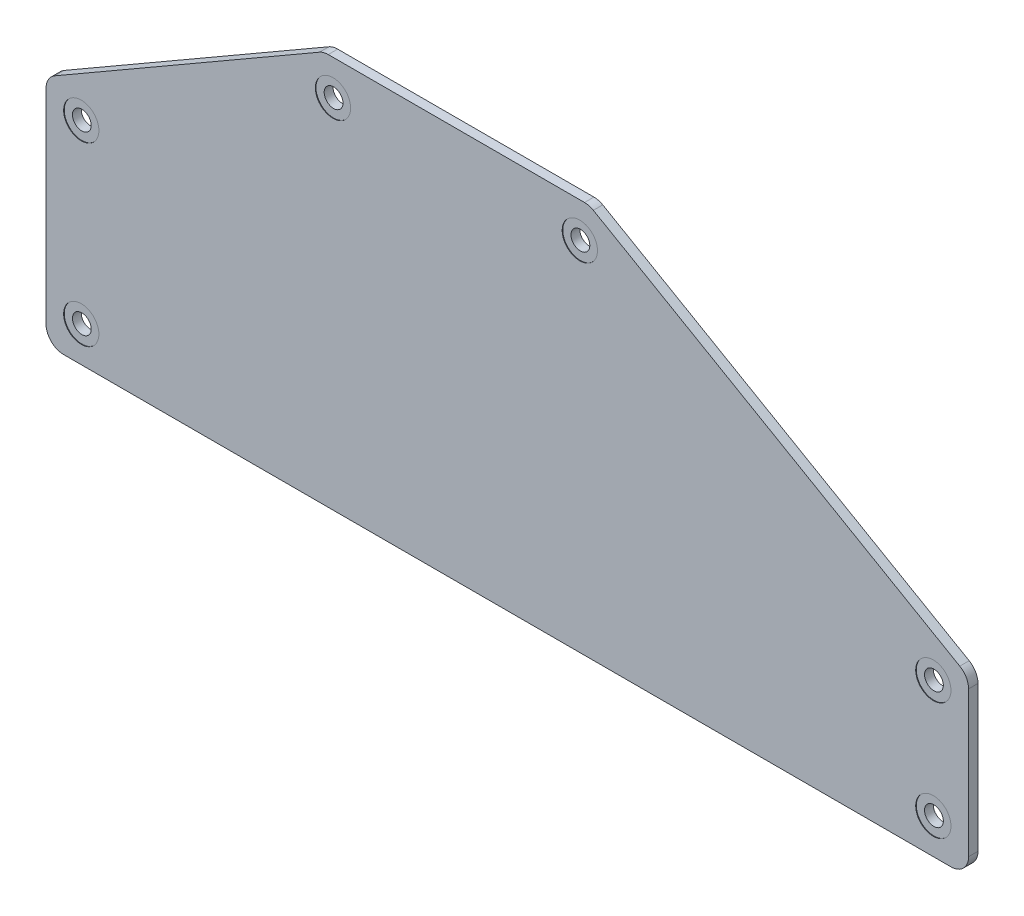
ISO-10303-21;
HEADER;
FILE_DESCRIPTION(('STEP AP214'),'2;1');
FILE_NAME('part.step','',(''),(''),'','','');
FILE_SCHEMA(('AUTOMOTIVE_DESIGN { 1 0 10303 214 1 1 1 1 }'));
ENDSEC;
DATA;
#1=APPLICATION_CONTEXT('core data for automotive mechanical design processes');
#2=APPLICATION_PROTOCOL_DEFINITION('international standard','automotive_design',2000,#1);
#3=PRODUCT_CONTEXT('',#1,'mechanical');
#4=PRODUCT('Part','Part','',(#3));
#5=PRODUCT_RELATED_PRODUCT_CATEGORY('part','',(#4));
#6=PRODUCT_DEFINITION_FORMATION('','',#4);
#7=PRODUCT_DEFINITION_CONTEXT('part definition',#1,'design');
#8=PRODUCT_DEFINITION('design','',#6,#7);
#9=PRODUCT_DEFINITION_SHAPE('','',#8);
#10=(LENGTH_UNIT() NAMED_UNIT(*) SI_UNIT(.MILLI.,.METRE.));
#11=(NAMED_UNIT(*) PLANE_ANGLE_UNIT() SI_UNIT($,.RADIAN.));
#12=(NAMED_UNIT(*) SI_UNIT($,.STERADIAN.) SOLID_ANGLE_UNIT());
#13=UNCERTAINTY_MEASURE_WITH_UNIT(LENGTH_MEASURE(1.E-05),#10,'distance_accuracy_value','');
#14=(GEOMETRIC_REPRESENTATION_CONTEXT(3) GLOBAL_UNCERTAINTY_ASSIGNED_CONTEXT((#13)) GLOBAL_UNIT_ASSIGNED_CONTEXT((#10,
#11,#12)) REPRESENTATION_CONTEXT('',''));
#15=CARTESIAN_POINT('',(0.,0.,0.));
#16=DIRECTION('',(0.,0.,1.));
#17=DIRECTION('',(1.,0.,0.));
#18=AXIS2_PLACEMENT_3D('',#15,#16,#17);
#19=CARTESIAN_POINT('',(151.,6.,1.6));
#20=DIRECTION('',(0.,0.,-1.));
#21=DIRECTION('',(-1.,0.,0.));
#22=AXIS2_PLACEMENT_3D('',#19,#20,#21);
#23=CYLINDRICAL_SURFACE('',#22,1.59999999999999);
#24=CARTESIAN_POINT('',(151.,6.,0.));
#25=DIRECTION('',(0.,0.,1.));
#26=DIRECTION('',(1.,0.,0.));
#27=AXIS2_PLACEMENT_3D('',#24,#25,#26);
#28=CIRCLE('',#27,1.59999999999999);
#29=CARTESIAN_POINT('',(152.6,6.,0.));
#30=VERTEX_POINT('',#29);
#31=EDGE_CURVE('E275',#30,#30,#28,.T.);
#32=ORIENTED_EDGE('',*,*,#31,.F.);
#33=EDGE_LOOP('',(#32));
#34=FACE_BOUND('',#33,.T.);
#35=CARTESIAN_POINT('',(151.,6.,1.5));
#36=DIRECTION('',(0.,0.,1.));
#37=DIRECTION('',(1.,0.,0.));
#38=AXIS2_PLACEMENT_3D('',#35,#36,#37);
#39=CIRCLE('',#38,1.59999999999999);
#40=CARTESIAN_POINT('',(152.6,6.,1.5));
#41=VERTEX_POINT('',#40);
#42=EDGE_CURVE('E39',#41,#41,#39,.T.);
#43=ORIENTED_EDGE('',*,*,#42,.T.);
#44=EDGE_LOOP('',(#43));
#45=FACE_BOUND('',#44,.T.);
#46=ADVANCED_FACE('F35',(#34,#45),#23,.F.);
#47=CARTESIAN_POINT('',(151.,26.,1.6));
#48=DIRECTION('',(0.,0.,-1.));
#49=DIRECTION('',(-1.,0.,0.));
#50=AXIS2_PLACEMENT_3D('',#47,#48,#49);
#51=CYLINDRICAL_SURFACE('',#50,1.59999999999999);
#52=CARTESIAN_POINT('',(151.,26.,0.));
#53=DIRECTION('',(0.,0.,1.));
#54=DIRECTION('',(1.,0.,0.));
#55=AXIS2_PLACEMENT_3D('',#52,#53,#54);
#56=CIRCLE('',#55,1.59999999999999);
#57=CARTESIAN_POINT('',(152.6,26.,0.));
#58=VERTEX_POINT('',#57);
#59=EDGE_CURVE('E272',#58,#58,#56,.T.);
#60=ORIENTED_EDGE('',*,*,#59,.F.);
#61=EDGE_LOOP('',(#60));
#62=FACE_BOUND('',#61,.T.);
#63=CARTESIAN_POINT('',(151.,26.,1.5));
#64=DIRECTION('',(0.,0.,1.));
#65=DIRECTION('',(1.,0.,0.));
#66=AXIS2_PLACEMENT_3D('',#63,#64,#65);
#67=CIRCLE('',#66,1.59999999999999);
#68=CARTESIAN_POINT('',(152.6,26.,1.5));
#69=VERTEX_POINT('',#68);
#70=EDGE_CURVE('E234',#69,#69,#67,.T.);
#71=ORIENTED_EDGE('',*,*,#70,.T.);
#72=EDGE_LOOP('',(#71));
#73=FACE_BOUND('',#72,.T.);
#74=ADVANCED_FACE('F338',(#62,#73),#51,.F.);
#75=CARTESIAN_POINT('',(90.8397459621557,60.7335388632658,1.6));
#76=DIRECTION('',(0.,0.,-1.));
#77=DIRECTION('',(-1.,0.,0.));
#78=AXIS2_PLACEMENT_3D('',#75,#76,#77);
#79=CYLINDRICAL_SURFACE('',#78,1.60000000000001);
#80=CARTESIAN_POINT('',(90.8397459621557,60.7335388632658,0.));
#81=DIRECTION('',(0.,0.,1.));
#82=DIRECTION('',(1.,0.,0.));
#83=AXIS2_PLACEMENT_3D('',#80,#81,#82);
#84=CIRCLE('',#83,1.60000000000001);
#85=CARTESIAN_POINT('',(92.4397459621557,60.7335388632658,0.));
#86=VERTEX_POINT('',#85);
#87=EDGE_CURVE('E269',#86,#86,#84,.T.);
#88=ORIENTED_EDGE('',*,*,#87,.F.);
#89=EDGE_LOOP('',(#88));
#90=FACE_BOUND('',#89,.T.);
#91=CARTESIAN_POINT('',(90.8397459621557,60.7335388632658,1.5));
#92=DIRECTION('',(0.,0.,1.));
#93=DIRECTION('',(1.,0.,0.));
#94=AXIS2_PLACEMENT_3D('',#91,#92,#93);
#95=CIRCLE('',#94,1.60000000000001);
#96=CARTESIAN_POINT('',(92.4397459621557,60.7335388632658,1.5));
#97=VERTEX_POINT('',#96);
#98=EDGE_CURVE('E230',#97,#97,#95,.T.);
#99=ORIENTED_EDGE('',*,*,#98,.T.);
#100=EDGE_LOOP('',(#99));
#101=FACE_BOUND('',#100,.T.);
#102=ADVANCED_FACE('F344',(#90,#101),#79,.F.);
#103=CARTESIAN_POINT('',(48.8397459621557,60.7335388632658,1.6));
#104=DIRECTION('',(0.,0.,-1.));
#105=DIRECTION('',(-1.,0.,0.));
#106=AXIS2_PLACEMENT_3D('',#103,#104,#105);
#107=CYLINDRICAL_SURFACE('',#106,1.6);
#108=CARTESIAN_POINT('',(48.8397459621557,60.7335388632658,0.));
#109=DIRECTION('',(0.,0.,1.));
#110=DIRECTION('',(1.,0.,0.));
#111=AXIS2_PLACEMENT_3D('',#108,#109,#110);
#112=CIRCLE('',#111,1.6);
#113=CARTESIAN_POINT('',(50.4397459621557,60.7335388632658,0.));
#114=VERTEX_POINT('',#113);
#115=EDGE_CURVE('E218',#114,#114,#112,.T.);
#116=ORIENTED_EDGE('',*,*,#115,.F.);
#117=EDGE_LOOP('',(#116));
#118=FACE_BOUND('',#117,.T.);
#119=CARTESIAN_POINT('',(48.8397459621557,60.7335388632658,1.5));
#120=DIRECTION('',(0.,0.,1.));
#121=DIRECTION('',(1.,0.,0.));
#122=AXIS2_PLACEMENT_3D('',#119,#120,#121);
#123=CIRCLE('',#122,1.6);
#124=CARTESIAN_POINT('',(50.4397459621557,60.7335388632658,1.5));
#125=VERTEX_POINT('',#124);
#126=EDGE_CURVE('E225',#125,#125,#123,.T.);
#127=ORIENTED_EDGE('',*,*,#126,.T.);
#128=EDGE_LOOP('',(#127));
#129=FACE_BOUND('',#128,.T.);
#130=ADVANCED_FACE('F358',(#118,#129),#107,.F.);
#131=CARTESIAN_POINT('',(6.,36.,1.6));
#132=DIRECTION('',(0.,0.,-1.));
#133=DIRECTION('',(-1.,0.,0.));
#134=AXIS2_PLACEMENT_3D('',#131,#132,#133);
#135=CYLINDRICAL_SURFACE('',#134,1.6);
#136=CARTESIAN_POINT('',(6.,36.,0.));
#137=DIRECTION('',(0.,0.,1.));
#138=DIRECTION('',(1.,0.,0.));
#139=AXIS2_PLACEMENT_3D('',#136,#137,#138);
#140=CIRCLE('',#139,1.6);
#141=CARTESIAN_POINT('',(7.6,36.,0.));
#142=VERTEX_POINT('',#141);
#143=EDGE_CURVE('E155',#142,#142,#140,.T.);
#144=ORIENTED_EDGE('',*,*,#143,.F.);
#145=EDGE_LOOP('',(#144));
#146=FACE_BOUND('',#145,.T.);
#147=CARTESIAN_POINT('',(6.,36.,1.5));
#148=DIRECTION('',(0.,0.,1.));
#149=DIRECTION('',(1.,0.,0.));
#150=AXIS2_PLACEMENT_3D('',#147,#148,#149);
#151=CIRCLE('',#150,1.6);
#152=CARTESIAN_POINT('',(7.6,36.,1.5));
#153=VERTEX_POINT('',#152);
#154=EDGE_CURVE('E220',#153,#153,#151,.T.);
#155=ORIENTED_EDGE('',*,*,#154,.T.);
#156=EDGE_LOOP('',(#155));
#157=FACE_BOUND('',#156,.T.);
#158=ADVANCED_FACE('F354',(#146,#157),#135,.F.);
#159=CARTESIAN_POINT('',(6.,6.,1.6));
#160=DIRECTION('',(0.,0.,-1.));
#161=DIRECTION('',(-1.,0.,0.));
#162=AXIS2_PLACEMENT_3D('',#159,#160,#161);
#163=CYLINDRICAL_SURFACE('',#162,1.6);
#164=CARTESIAN_POINT('',(6.,6.,0.));
#165=DIRECTION('',(0.,0.,1.));
#166=DIRECTION('',(1.,0.,0.));
#167=AXIS2_PLACEMENT_3D('',#164,#165,#166);
#168=CIRCLE('',#167,1.6);
#169=CARTESIAN_POINT('',(7.6,6.,0.));
#170=VERTEX_POINT('',#169);
#171=EDGE_CURVE('E161',#170,#170,#168,.T.);
#172=ORIENTED_EDGE('',*,*,#171,.F.);
#173=EDGE_LOOP('',(#172));
#174=FACE_BOUND('',#173,.T.);
#175=CARTESIAN_POINT('',(6.,6.,1.5));
#176=DIRECTION('',(0.,0.,1.));
#177=DIRECTION('',(1.,0.,0.));
#178=AXIS2_PLACEMENT_3D('',#175,#176,#177);
#179=CIRCLE('',#178,1.6);
#180=CARTESIAN_POINT('',(7.6,6.,1.5));
#181=VERTEX_POINT('',#180);
#182=EDGE_CURVE('E215',#181,#181,#179,.T.);
#183=ORIENTED_EDGE('',*,*,#182,.T.);
#184=EDGE_LOOP('',(#183));
#185=FACE_BOUND('',#184,.T.);
#186=ADVANCED_FACE('F351',(#174,#185),#163,.F.);
#187=CARTESIAN_POINT('',(0.,0.,1.6));
#188=DIRECTION('',(0.,0.,1.));
#189=DIRECTION('',(1.,0.,0.));
#190=AXIS2_PLACEMENT_3D('',#187,#188,#189);
#191=PLANE('',#190);
#192=CARTESIAN_POINT('',(151.,6.,1.6));
#193=DIRECTION('',(0.,0.,1.));
#194=DIRECTION('',(1.,0.,0.));
#195=AXIS2_PLACEMENT_3D('',#192,#193,#194);
#196=CIRCLE('',#195,2.99999999999999);
#197=CARTESIAN_POINT('',(154.,6.,1.6));
#198=VERTEX_POINT('',#197);
#199=EDGE_CURVE('E250',#198,#198,#196,.T.);
#200=ORIENTED_EDGE('',*,*,#199,.F.);
#201=EDGE_LOOP('',(#200));
#202=FACE_BOUND('',#201,.T.);
#203=CARTESIAN_POINT('',(151.,26.,1.6));
#204=DIRECTION('',(0.,0.,1.));
#205=DIRECTION('',(1.,0.,0.));
#206=AXIS2_PLACEMENT_3D('',#203,#204,#205);
#207=CIRCLE('',#206,2.99999999999999);
#208=CARTESIAN_POINT('',(154.,26.,1.6));
#209=VERTEX_POINT('',#208);
#210=EDGE_CURVE('E243',#209,#209,#207,.T.);
#211=ORIENTED_EDGE('',*,*,#210,.F.);
#212=EDGE_LOOP('',(#211));
#213=FACE_BOUND('',#212,.T.);
#214=CARTESIAN_POINT('',(90.8397459621557,60.7335388632658,1.6));
#215=DIRECTION('',(0.,0.,1.));
#216=DIRECTION('',(1.,0.,0.));
#217=AXIS2_PLACEMENT_3D('',#214,#215,#216);
#218=CIRCLE('',#217,3.00000000000001);
#219=CARTESIAN_POINT('',(93.8397459621557,60.7335388632658,1.6));
#220=VERTEX_POINT('',#219);
#221=EDGE_CURVE('E236',#220,#220,#218,.T.);
#222=ORIENTED_EDGE('',*,*,#221,.F.);
#223=EDGE_LOOP('',(#222));
#224=FACE_BOUND('',#223,.T.);
#225=CARTESIAN_POINT('',(48.8397459621557,60.7335388632658,1.6));
#226=DIRECTION('',(0.,0.,1.));
#227=DIRECTION('',(1.,0.,0.));
#228=AXIS2_PLACEMENT_3D('',#225,#226,#227);
#229=CIRCLE('',#228,3.);
#230=CARTESIAN_POINT('',(51.8397459621557,60.7335388632658,1.6));
#231=VERTEX_POINT('',#230);
#232=EDGE_CURVE('E232',#231,#231,#229,.T.);
#233=ORIENTED_EDGE('',*,*,#232,.F.);
#234=EDGE_LOOP('',(#233));
#235=FACE_BOUND('',#234,.T.);
#236=CARTESIAN_POINT('',(6.,36.,1.6));
#237=DIRECTION('',(0.,0.,1.));
#238=DIRECTION('',(1.,0.,0.));
#239=AXIS2_PLACEMENT_3D('',#236,#237,#238);
#240=CIRCLE('',#239,3.);
#241=CARTESIAN_POINT('',(9.,36.,1.6));
#242=VERTEX_POINT('',#241);
#243=EDGE_CURVE('E228',#242,#242,#240,.T.);
#244=ORIENTED_EDGE('',*,*,#243,.F.);
#245=EDGE_LOOP('',(#244));
#246=FACE_BOUND('',#245,.T.);
#247=CARTESIAN_POINT('',(6.,6.,1.6));
#248=DIRECTION('',(0.,0.,1.));
#249=DIRECTION('',(1.,0.,0.));
#250=AXIS2_PLACEMENT_3D('',#247,#248,#249);
#251=CIRCLE('',#250,3.);
#252=CARTESIAN_POINT('',(9.,6.,1.6));
#253=VERTEX_POINT('',#252);
#254=EDGE_CURVE('E223',#253,#253,#251,.T.);
#255=ORIENTED_EDGE('',*,*,#254,.F.);
#256=EDGE_LOOP('',(#255));
#257=FACE_BOUND('',#256,.T.);
#258=DIRECTION('',(-0.866025403784439,-0.499999999999999,0.));
#259=VECTOR('',#258,1.);
#260=CARTESIAN_POINT('',(47.2320508075689,66.7335388632658,1.6));
#261=LINE('',#260,#259);
#262=CARTESIAN_POINT('',(46.5358983848623,66.3316150746191,1.6));
#263=VERTEX_POINT('',#262);
#264=CARTESIAN_POINT('',(1.50000000000002,40.3301270189223,1.6));
#265=VERTEX_POINT('',#264);
#266=EDGE_CURVE('E164',#263,#265,#261,.T.);
#267=ORIENTED_EDGE('',*,*,#266,.T.);
#268=CARTESIAN_POINT('',(3.,37.732050807569,1.6));
#269=DIRECTION('',(0.,0.,1.));
#270=DIRECTION('',(1.,0.,0.));
#271=AXIS2_PLACEMENT_3D('',#268,#269,#270);
#272=CIRCLE('',#271,3.);
#273=CARTESIAN_POINT('',(0.,37.732050807569,1.6));
#274=VERTEX_POINT('',#273);
#275=EDGE_CURVE('E197',#265,#274,#272,.T.);
#276=ORIENTED_EDGE('',*,*,#275,.T.);
#277=DIRECTION('',(0.,-1.,0.));
#278=VECTOR('',#277,1.);
#279=CARTESIAN_POINT('',(0.,39.4641016151378,1.6));
#280=LINE('',#279,#278);
#281=CARTESIAN_POINT('',(0.,3.,1.6));
#282=VERTEX_POINT('',#281);
#283=EDGE_CURVE('E147',#274,#282,#280,.T.);
#284=ORIENTED_EDGE('',*,*,#283,.T.);
#285=CARTESIAN_POINT('',(3.,3.,1.6));
#286=DIRECTION('',(0.,0.,1.));
#287=DIRECTION('',(1.,0.,0.));
#288=AXIS2_PLACEMENT_3D('',#285,#286,#287);
#289=CIRCLE('',#288,3.);
#290=CARTESIAN_POINT('',(3.,0.,1.6));
#291=VERTEX_POINT('',#290);
#292=EDGE_CURVE('E188',#282,#291,#289,.T.);
#293=ORIENTED_EDGE('',*,*,#292,.T.);
#294=DIRECTION('',(1.,0.,0.));
#295=VECTOR('',#294,1.);
#296=CARTESIAN_POINT('',(0.,0.,1.6));
#297=LINE('',#296,#295);
#298=CARTESIAN_POINT('',(154.,0.,1.6));
#299=VERTEX_POINT('',#298);
#300=EDGE_CURVE('E281',#291,#299,#297,.T.);
#301=ORIENTED_EDGE('',*,*,#300,.T.);
#302=CARTESIAN_POINT('',(154.,3.,1.6));
#303=DIRECTION('',(0.,0.,1.));
#304=DIRECTION('',(1.,0.,0.));
#305=AXIS2_PLACEMENT_3D('',#302,#303,#304);
#306=CIRCLE('',#305,3.);
#307=CARTESIAN_POINT('',(157.,3.,1.6));
#308=VERTEX_POINT('',#307);
#309=EDGE_CURVE('E190',#299,#308,#306,.T.);
#310=ORIENTED_EDGE('',*,*,#309,.T.);
#311=DIRECTION('',(0.,1.,0.));
#312=VECTOR('',#311,1.);
#313=CARTESIAN_POINT('',(157.,0.,1.6));
#314=LINE('',#313,#312);
#315=CARTESIAN_POINT('',(157.,27.7320508075689,1.6));
#316=VERTEX_POINT('',#315);
#317=EDGE_CURVE('E284',#308,#316,#314,.T.);
#318=ORIENTED_EDGE('',*,*,#317,.T.);
#319=CARTESIAN_POINT('',(154.,27.7320508075689,1.6));
#320=DIRECTION('',(0.,0.,1.));
#321=DIRECTION('',(1.,0.,0.));
#322=AXIS2_PLACEMENT_3D('',#319,#320,#321);
#323=CIRCLE('',#322,3.);
#324=CARTESIAN_POINT('',(155.5,30.3301270189222,1.6));
#325=VERTEX_POINT('',#324);
#326=EDGE_CURVE('E192',#316,#325,#323,.T.);
#327=ORIENTED_EDGE('',*,*,#326,.T.);
#328=DIRECTION('',(-0.866025403784439,0.5,0.));
#329=VECTOR('',#328,1.);
#330=CARTESIAN_POINT('',(157.,29.4641016151378,1.6));
#331=LINE('',#330,#329);
#332=CARTESIAN_POINT('',(93.143593539449,66.3316150746191,1.6));
#333=VERTEX_POINT('',#332);
#334=EDGE_CURVE('E287',#325,#333,#331,.T.);
#335=ORIENTED_EDGE('',*,*,#334,.T.);
#336=CARTESIAN_POINT('',(91.643593539449,63.7335388632658,1.6));
#337=DIRECTION('',(0.,0.,1.));
#338=DIRECTION('',(1.,0.,0.));
#339=AXIS2_PLACEMENT_3D('',#336,#337,#338);
#340=CIRCLE('',#339,3.);
#341=CARTESIAN_POINT('',(91.643593539449,66.7335388632658,1.6));
#342=VERTEX_POINT('',#341);
#343=EDGE_CURVE('E59',#333,#342,#340,.T.);
#344=ORIENTED_EDGE('',*,*,#343,.T.);
#345=DIRECTION('',(-1.,0.,0.));
#346=VECTOR('',#345,1.);
#347=CARTESIAN_POINT('',(92.4474411167423,66.7335388632658,1.6));
#348=LINE('',#347,#346);
#349=CARTESIAN_POINT('',(48.0358983848623,66.7335388632658,1.6));
#350=VERTEX_POINT('',#349);
#351=EDGE_CURVE('E288',#342,#350,#348,.T.);
#352=ORIENTED_EDGE('',*,*,#351,.T.);
#353=CARTESIAN_POINT('',(48.0358983848623,63.7335388632658,1.6));
#354=DIRECTION('',(0.,0.,1.));
#355=DIRECTION('',(1.,0.,0.));
#356=AXIS2_PLACEMENT_3D('',#353,#354,#355);
#357=CIRCLE('',#356,3.);
#358=EDGE_CURVE('E195',#350,#263,#357,.T.);
#359=ORIENTED_EDGE('',*,*,#358,.T.);
#360=EDGE_LOOP('',(#267,#276,#284,#293,#301,#310,#318,#327,#335,#344,#352,#359));
#361=FACE_BOUND('',#360,.T.);
#362=ADVANCED_FACE('F292',(#202,#213,#224,#235,#246,#257,#361),#191,.T.);
#363=CARTESIAN_POINT('',(0.,0.,0.));
#364=DIRECTION('',(0.,0.,1.));
#365=DIRECTION('',(1.,0.,0.));
#366=AXIS2_PLACEMENT_3D('',#363,#364,#365);
#367=PLANE('',#366);
#368=DIRECTION('',(0.,-1.,0.));
#369=VECTOR('',#368,1.);
#370=CARTESIAN_POINT('',(0.,39.4641016151378,0.));
#371=LINE('',#370,#369);
#372=CARTESIAN_POINT('',(0.,37.732050807569,0.));
#373=VERTEX_POINT('',#372);
#374=CARTESIAN_POINT('',(0.,3.,0.));
#375=VERTEX_POINT('',#374);
#376=EDGE_CURVE('E144',#373,#375,#371,.T.);
#377=ORIENTED_EDGE('',*,*,#376,.F.);
#378=CARTESIAN_POINT('',(3.,37.732050807569,0.));
#379=DIRECTION('',(0.,0.,1.));
#380=DIRECTION('',(1.,0.,0.));
#381=AXIS2_PLACEMENT_3D('',#378,#379,#380);
#382=CIRCLE('',#381,3.);
#383=CARTESIAN_POINT('',(1.50000000000002,40.3301270189223,0.));
#384=VERTEX_POINT('',#383);
#385=EDGE_CURVE('E127',#373,#384,#382,.F.);
#386=ORIENTED_EDGE('',*,*,#385,.T.);
#387=DIRECTION('',(-0.866025403784439,-0.499999999999999,0.));
#388=VECTOR('',#387,1.);
#389=CARTESIAN_POINT('',(47.2320508075689,66.7335388632658,0.));
#390=LINE('',#389,#388);
#391=CARTESIAN_POINT('',(46.5358983848623,66.3316150746191,0.));
#392=VERTEX_POINT('',#391);
#393=EDGE_CURVE('E174',#392,#384,#390,.T.);
#394=ORIENTED_EDGE('',*,*,#393,.F.);
#395=CARTESIAN_POINT('',(48.0358983848623,63.7335388632658,0.));
#396=DIRECTION('',(0.,0.,1.));
#397=DIRECTION('',(1.,0.,0.));
#398=AXIS2_PLACEMENT_3D('',#395,#396,#397);
#399=CIRCLE('',#398,3.);
#400=CARTESIAN_POINT('',(48.0358983848623,66.7335388632658,0.));
#401=VERTEX_POINT('',#400);
#402=EDGE_CURVE('E138',#392,#401,#399,.F.);
#403=ORIENTED_EDGE('',*,*,#402,.T.);
#404=DIRECTION('',(-1.,0.,0.));
#405=VECTOR('',#404,1.);
#406=CARTESIAN_POINT('',(92.4474411167423,66.7335388632658,0.));
#407=LINE('',#406,#405);
#408=CARTESIAN_POINT('',(91.643593539449,66.7335388632658,0.));
#409=VERTEX_POINT('',#408);
#410=EDGE_CURVE('E172',#409,#401,#407,.T.);
#411=ORIENTED_EDGE('',*,*,#410,.F.);
#412=CARTESIAN_POINT('',(91.643593539449,63.7335388632658,0.));
#413=DIRECTION('',(0.,0.,1.));
#414=DIRECTION('',(1.,0.,0.));
#415=AXIS2_PLACEMENT_3D('',#412,#413,#414);
#416=CIRCLE('',#415,3.);
#417=CARTESIAN_POINT('',(93.143593539449,66.3316150746191,0.));
#418=VERTEX_POINT('',#417);
#419=EDGE_CURVE('E182',#409,#418,#416,.F.);
#420=ORIENTED_EDGE('',*,*,#419,.T.);
#421=DIRECTION('',(-0.866025403784439,0.5,0.));
#422=VECTOR('',#421,1.);
#423=CARTESIAN_POINT('',(157.,29.4641016151378,0.));
#424=LINE('',#423,#422);
#425=CARTESIAN_POINT('',(155.5,30.3301270189222,0.));
#426=VERTEX_POINT('',#425);
#427=EDGE_CURVE('E169',#426,#418,#424,.T.);
#428=ORIENTED_EDGE('',*,*,#427,.F.);
#429=CARTESIAN_POINT('',(154.,27.7320508075689,0.));
#430=DIRECTION('',(0.,0.,1.));
#431=DIRECTION('',(1.,0.,0.));
#432=AXIS2_PLACEMENT_3D('',#429,#430,#431);
#433=CIRCLE('',#432,3.);
#434=CARTESIAN_POINT('',(157.,27.7320508075689,0.));
#435=VERTEX_POINT('',#434);
#436=EDGE_CURVE('E180',#426,#435,#433,.F.);
#437=ORIENTED_EDGE('',*,*,#436,.T.);
#438=DIRECTION('',(0.,1.,0.));
#439=VECTOR('',#438,1.);
#440=CARTESIAN_POINT('',(157.,0.,0.));
#441=LINE('',#440,#439);
#442=CARTESIAN_POINT('',(157.,3.,0.));
#443=VERTEX_POINT('',#442);
#444=EDGE_CURVE('E158',#443,#435,#441,.T.);
#445=ORIENTED_EDGE('',*,*,#444,.F.);
#446=CARTESIAN_POINT('',(154.,3.,0.));
#447=DIRECTION('',(0.,0.,1.));
#448=DIRECTION('',(1.,0.,0.));
#449=AXIS2_PLACEMENT_3D('',#446,#447,#448);
#450=CIRCLE('',#449,3.);
#451=CARTESIAN_POINT('',(154.,0.,0.));
#452=VERTEX_POINT('',#451);
#453=EDGE_CURVE('E178',#443,#452,#450,.F.);
#454=ORIENTED_EDGE('',*,*,#453,.T.);
#455=DIRECTION('',(1.,0.,0.));
#456=VECTOR('',#455,1.);
#457=CARTESIAN_POINT('',(0.,0.,0.));
#458=LINE('',#457,#456);
#459=CARTESIAN_POINT('',(3.,0.,0.));
#460=VERTEX_POINT('',#459);
#461=EDGE_CURVE('E154',#460,#452,#458,.T.);
#462=ORIENTED_EDGE('',*,*,#461,.F.);
#463=CARTESIAN_POINT('',(3.,3.,0.));
#464=DIRECTION('',(0.,0.,1.));
#465=DIRECTION('',(1.,0.,0.));
#466=AXIS2_PLACEMENT_3D('',#463,#464,#465);
#467=CIRCLE('',#466,3.);
#468=EDGE_CURVE('E148',#460,#375,#467,.F.);
#469=ORIENTED_EDGE('',*,*,#468,.T.);
#470=EDGE_LOOP('',(#377,#386,#394,#403,#411,#420,#428,#437,#445,#454,#462,#469));
#471=FACE_BOUND('',#470,.T.);
#472=ORIENTED_EDGE('',*,*,#143,.T.);
#473=EDGE_LOOP('',(#472));
#474=FACE_BOUND('',#473,.T.);
#475=ORIENTED_EDGE('',*,*,#171,.T.);
#476=EDGE_LOOP('',(#475));
#477=FACE_BOUND('',#476,.T.);
#478=ORIENTED_EDGE('',*,*,#31,.T.);
#479=EDGE_LOOP('',(#478));
#480=FACE_BOUND('',#479,.T.);
#481=ORIENTED_EDGE('',*,*,#59,.T.);
#482=EDGE_LOOP('',(#481));
#483=FACE_BOUND('',#482,.T.);
#484=ORIENTED_EDGE('',*,*,#87,.T.);
#485=EDGE_LOOP('',(#484));
#486=FACE_BOUND('',#485,.T.);
#487=ORIENTED_EDGE('',*,*,#115,.T.);
#488=EDGE_LOOP('',(#487));
#489=FACE_BOUND('',#488,.T.);
#490=ADVANCED_FACE('F151',(#471,#474,#477,#480,#483,#486,#489),#367,.F.);
#491=CARTESIAN_POINT('',(0.,39.4641016151378,1.6));
#492=DIRECTION('',(1.,0.,0.));
#493=DIRECTION('',(0.,1.,0.));
#494=AXIS2_PLACEMENT_3D('',#491,#492,#493);
#495=PLANE('',#494);
#496=ORIENTED_EDGE('',*,*,#283,.F.);
#497=DIRECTION('',(0.,0.,-1.));
#498=VECTOR('',#497,1.);
#499=CARTESIAN_POINT('',(0.,37.732050807569,1.6));
#500=LINE('',#499,#498);
#501=EDGE_CURVE('E131',#274,#373,#500,.T.);
#502=ORIENTED_EDGE('',*,*,#501,.T.);
#503=ORIENTED_EDGE('',*,*,#376,.T.);
#504=DIRECTION('',(0.,0.,-1.));
#505=VECTOR('',#504,1.);
#506=CARTESIAN_POINT('',(0.,3.,1.6));
#507=LINE('',#506,#505);
#508=EDGE_CURVE('E149',#375,#282,#507,.F.);
#509=ORIENTED_EDGE('',*,*,#508,.T.);
#510=EDGE_LOOP('',(#496,#502,#503,#509));
#511=FACE_BOUND('',#510,.T.);
#512=ADVANCED_FACE('F143',(#511),#495,.F.);
#513=CARTESIAN_POINT('',(0.,0.,1.6));
#514=DIRECTION('',(0.,1.,0.));
#515=DIRECTION('',(0.,0.,1.));
#516=AXIS2_PLACEMENT_3D('',#513,#514,#515);
#517=PLANE('',#516);
#518=ORIENTED_EDGE('',*,*,#461,.T.);
#519=DIRECTION('',(0.,0.,-1.));
#520=VECTOR('',#519,1.);
#521=CARTESIAN_POINT('',(154.,0.,1.6));
#522=LINE('',#521,#520);
#523=EDGE_CURVE('E11',#452,#299,#522,.F.);
#524=ORIENTED_EDGE('',*,*,#523,.T.);
#525=ORIENTED_EDGE('',*,*,#300,.F.);
#526=DIRECTION('',(0.,0.,-1.));
#527=VECTOR('',#526,1.);
#528=CARTESIAN_POINT('',(3.,0.,1.6));
#529=LINE('',#528,#527);
#530=EDGE_CURVE('E44',#291,#460,#529,.T.);
#531=ORIENTED_EDGE('',*,*,#530,.T.);
#532=EDGE_LOOP('',(#518,#524,#525,#531));
#533=FACE_BOUND('',#532,.T.);
#534=ADVANCED_FACE('F323',(#533),#517,.F.);
#535=CARTESIAN_POINT('',(157.,0.,1.6));
#536=DIRECTION('',(-1.,0.,0.));
#537=DIRECTION('',(0.,0.,1.));
#538=AXIS2_PLACEMENT_3D('',#535,#536,#537);
#539=PLANE('',#538);
#540=ORIENTED_EDGE('',*,*,#444,.T.);
#541=DIRECTION('',(0.,0.,-1.));
#542=VECTOR('',#541,1.);
#543=CARTESIAN_POINT('',(157.,27.7320508075689,1.6));
#544=LINE('',#543,#542);
#545=EDGE_CURVE('E211',#435,#316,#544,.F.);
#546=ORIENTED_EDGE('',*,*,#545,.T.);
#547=ORIENTED_EDGE('',*,*,#317,.F.);
#548=DIRECTION('',(0.,0.,-1.));
#549=VECTOR('',#548,1.);
#550=CARTESIAN_POINT('',(157.,3.,1.6));
#551=LINE('',#550,#549);
#552=EDGE_CURVE('E208',#308,#443,#551,.T.);
#553=ORIENTED_EDGE('',*,*,#552,.T.);
#554=EDGE_LOOP('',(#540,#546,#547,#553));
#555=FACE_BOUND('',#554,.T.);
#556=ADVANCED_FACE('F315',(#555),#539,.F.);
#557=CARTESIAN_POINT('',(157.,29.4641016151378,1.6));
#558=DIRECTION('',(-0.5,-0.866025403784439,0.));
#559=DIRECTION('',(0.866025403784439,-0.5,0.));
#560=AXIS2_PLACEMENT_3D('',#557,#558,#559);
#561=PLANE('',#560);
#562=ORIENTED_EDGE('',*,*,#427,.T.);
#563=DIRECTION('',(0.,0.,-1.));
#564=VECTOR('',#563,1.);
#565=CARTESIAN_POINT('',(93.143593539449,66.3316150746191,1.6));
#566=LINE('',#565,#564);
#567=EDGE_CURVE('E206',#418,#333,#566,.F.);
#568=ORIENTED_EDGE('',*,*,#567,.T.);
#569=ORIENTED_EDGE('',*,*,#334,.F.);
#570=DIRECTION('',(0.,0.,-1.));
#571=VECTOR('',#570,1.);
#572=CARTESIAN_POINT('',(155.5,30.3301270189222,1.6));
#573=LINE('',#572,#571);
#574=EDGE_CURVE('E203',#325,#426,#573,.T.);
#575=ORIENTED_EDGE('',*,*,#574,.T.);
#576=EDGE_LOOP('',(#562,#568,#569,#575));
#577=FACE_BOUND('',#576,.T.);
#578=ADVANCED_FACE('F306',(#577),#561,.F.);
#579=CARTESIAN_POINT('',(92.4474411167423,66.7335388632658,1.6));
#580=DIRECTION('',(0.,-1.,0.));
#581=DIRECTION('',(0.,0.,-1.));
#582=AXIS2_PLACEMENT_3D('',#579,#580,#581);
#583=PLANE('',#582);
#584=ORIENTED_EDGE('',*,*,#410,.T.);
#585=DIRECTION('',(0.,0.,-1.));
#586=VECTOR('',#585,1.);
#587=CARTESIAN_POINT('',(48.0358983848623,66.7335388632658,1.6));
#588=LINE('',#587,#586);
#589=EDGE_CURVE('E52',#401,#350,#588,.F.);
#590=ORIENTED_EDGE('',*,*,#589,.T.);
#591=ORIENTED_EDGE('',*,*,#351,.F.);
#592=DIRECTION('',(0.,0.,-1.));
#593=VECTOR('',#592,1.);
#594=CARTESIAN_POINT('',(91.643593539449,66.7335388632658,1.6));
#595=LINE('',#594,#593);
#596=EDGE_CURVE('E199',#342,#409,#595,.T.);
#597=ORIENTED_EDGE('',*,*,#596,.T.);
#598=EDGE_LOOP('',(#584,#590,#591,#597));
#599=FACE_BOUND('',#598,.T.);
#600=ADVANCED_FACE('F299',(#599),#583,.F.);
#601=CARTESIAN_POINT('',(47.2320508075689,66.7335388632658,1.6));
#602=DIRECTION('',(0.499999999999999,-0.866025403784439,0.));
#603=DIRECTION('',(0.866025403784439,0.499999999999999,0.));
#604=AXIS2_PLACEMENT_3D('',#601,#602,#603);
#605=PLANE('',#604);
#606=ORIENTED_EDGE('',*,*,#393,.T.);
#607=DIRECTION('',(0.,0.,-1.));
#608=VECTOR('',#607,1.);
#609=CARTESIAN_POINT('',(1.5,40.3301270189223,1.6));
#610=LINE('',#609,#608);
#611=EDGE_CURVE('E132',#384,#265,#610,.F.);
#612=ORIENTED_EDGE('',*,*,#611,.T.);
#613=ORIENTED_EDGE('',*,*,#266,.F.);
#614=DIRECTION('',(0.,0.,-1.));
#615=VECTOR('',#614,1.);
#616=CARTESIAN_POINT('',(46.5358983848623,66.3316150746191,1.6));
#617=LINE('',#616,#615);
#618=EDGE_CURVE('E137',#263,#392,#617,.T.);
#619=ORIENTED_EDGE('',*,*,#618,.T.);
#620=EDGE_LOOP('',(#606,#612,#613,#619));
#621=FACE_BOUND('',#620,.T.);
#622=ADVANCED_FACE('F295',(#621),#605,.F.);
#623=CARTESIAN_POINT('',(3.,37.732050807569,1.6));
#624=DIRECTION('',(0.,0.,-1.));
#625=DIRECTION('',(-1.,0.,0.));
#626=AXIS2_PLACEMENT_3D('',#623,#624,#625);
#627=CYLINDRICAL_SURFACE('',#626,3.);
#628=ORIENTED_EDGE('',*,*,#275,.F.);
#629=ORIENTED_EDGE('',*,*,#611,.F.);
#630=ORIENTED_EDGE('',*,*,#385,.F.);
#631=ORIENTED_EDGE('',*,*,#501,.F.);
#632=EDGE_LOOP('',(#628,#629,#630,#631));
#633=FACE_BOUND('',#632,.T.);
#634=ADVANCED_FACE('F130',(#633),#627,.T.);
#635=CARTESIAN_POINT('',(48.0358983848623,63.7335388632658,1.6));
#636=DIRECTION('',(0.,0.,-1.));
#637=DIRECTION('',(-1.,0.,0.));
#638=AXIS2_PLACEMENT_3D('',#635,#636,#637);
#639=CYLINDRICAL_SURFACE('',#638,3.);
#640=ORIENTED_EDGE('',*,*,#358,.F.);
#641=ORIENTED_EDGE('',*,*,#589,.F.);
#642=ORIENTED_EDGE('',*,*,#402,.F.);
#643=ORIENTED_EDGE('',*,*,#618,.F.);
#644=EDGE_LOOP('',(#640,#641,#642,#643));
#645=FACE_BOUND('',#644,.T.);
#646=ADVANCED_FACE('F297',(#645),#639,.T.);
#647=CARTESIAN_POINT('',(91.643593539449,63.7335388632658,1.6));
#648=DIRECTION('',(0.,0.,-1.));
#649=DIRECTION('',(-1.,0.,0.));
#650=AXIS2_PLACEMENT_3D('',#647,#648,#649);
#651=CYLINDRICAL_SURFACE('',#650,3.);
#652=ORIENTED_EDGE('',*,*,#343,.F.);
#653=ORIENTED_EDGE('',*,*,#567,.F.);
#654=ORIENTED_EDGE('',*,*,#419,.F.);
#655=ORIENTED_EDGE('',*,*,#596,.F.);
#656=EDGE_LOOP('',(#652,#653,#654,#655));
#657=FACE_BOUND('',#656,.T.);
#658=ADVANCED_FACE('F302',(#657),#651,.T.);
#659=CARTESIAN_POINT('',(154.,27.7320508075689,1.6));
#660=DIRECTION('',(0.,0.,-1.));
#661=DIRECTION('',(-1.,0.,0.));
#662=AXIS2_PLACEMENT_3D('',#659,#660,#661);
#663=CYLINDRICAL_SURFACE('',#662,3.);
#664=ORIENTED_EDGE('',*,*,#326,.F.);
#665=ORIENTED_EDGE('',*,*,#545,.F.);
#666=ORIENTED_EDGE('',*,*,#436,.F.);
#667=ORIENTED_EDGE('',*,*,#574,.F.);
#668=EDGE_LOOP('',(#664,#665,#666,#667));
#669=FACE_BOUND('',#668,.T.);
#670=ADVANCED_FACE('F311',(#669),#663,.T.);
#671=CARTESIAN_POINT('',(154.,3.,1.6));
#672=DIRECTION('',(0.,0.,-1.));
#673=DIRECTION('',(-1.,0.,0.));
#674=AXIS2_PLACEMENT_3D('',#671,#672,#673);
#675=CYLINDRICAL_SURFACE('',#674,3.);
#676=ORIENTED_EDGE('',*,*,#309,.F.);
#677=ORIENTED_EDGE('',*,*,#523,.F.);
#678=ORIENTED_EDGE('',*,*,#453,.F.);
#679=ORIENTED_EDGE('',*,*,#552,.F.);
#680=EDGE_LOOP('',(#676,#677,#678,#679));
#681=FACE_BOUND('',#680,.T.);
#682=ADVANCED_FACE('F320',(#681),#675,.T.);
#683=CARTESIAN_POINT('',(3.,3.,1.6));
#684=DIRECTION('',(0.,0.,-1.));
#685=DIRECTION('',(-1.,0.,0.));
#686=AXIS2_PLACEMENT_3D('',#683,#684,#685);
#687=CYLINDRICAL_SURFACE('',#686,3.);
#688=ORIENTED_EDGE('',*,*,#292,.F.);
#689=ORIENTED_EDGE('',*,*,#508,.F.);
#690=ORIENTED_EDGE('',*,*,#468,.F.);
#691=ORIENTED_EDGE('',*,*,#530,.F.);
#692=EDGE_LOOP('',(#688,#689,#690,#691));
#693=FACE_BOUND('',#692,.T.);
#694=ADVANCED_FACE('F37',(#693),#687,.T.);
#695=CARTESIAN_POINT('',(6.,6.,1.5));
#696=DIRECTION('',(0.,0.,1.));
#697=DIRECTION('',(1.,0.,0.));
#698=AXIS2_PLACEMENT_3D('',#695,#696,#697);
#699=CYLINDRICAL_SURFACE('',#698,3.);
#700=CARTESIAN_POINT('',(6.,6.,1.5));
#701=DIRECTION('',(0.,0.,1.));
#702=DIRECTION('',(1.,0.,0.));
#703=AXIS2_PLACEMENT_3D('',#700,#701,#702);
#704=CIRCLE('',#703,3.);
#705=CARTESIAN_POINT('',(9.,6.,1.5));
#706=VERTEX_POINT('',#705);
#707=EDGE_CURVE('E219',#706,#706,#704,.T.);
#708=ORIENTED_EDGE('',*,*,#707,.F.);
#709=EDGE_LOOP('',(#708));
#710=FACE_BOUND('',#709,.T.);
#711=ORIENTED_EDGE('',*,*,#254,.T.);
#712=EDGE_LOOP('',(#711));
#713=FACE_BOUND('',#712,.T.);
#714=ADVANCED_FACE('F329',(#710,#713),#699,.F.);
#715=CARTESIAN_POINT('',(6.,6.,1.5));
#716=DIRECTION('',(0.,0.,1.));
#717=DIRECTION('',(1.,0.,0.));
#718=AXIS2_PLACEMENT_3D('',#715,#716,#717);
#719=PLANE('',#718);
#720=ORIENTED_EDGE('',*,*,#182,.F.);
#721=EDGE_LOOP('',(#720));
#722=FACE_BOUND('',#721,.T.);
#723=ORIENTED_EDGE('',*,*,#707,.T.);
#724=EDGE_LOOP('',(#723));
#725=FACE_BOUND('',#724,.T.);
#726=ADVANCED_FACE('F334',(#722,#725),#719,.T.);
#727=CARTESIAN_POINT('',(6.,36.,1.5));
#728=DIRECTION('',(0.,0.,1.));
#729=DIRECTION('',(1.,0.,0.));
#730=AXIS2_PLACEMENT_3D('',#727,#728,#729);
#731=CYLINDRICAL_SURFACE('',#730,3.);
#732=CARTESIAN_POINT('',(6.,36.,1.5));
#733=DIRECTION('',(0.,0.,1.));
#734=DIRECTION('',(1.,0.,0.));
#735=AXIS2_PLACEMENT_3D('',#732,#733,#734);
#736=CIRCLE('',#735,3.);
#737=CARTESIAN_POINT('',(9.,36.,1.5));
#738=VERTEX_POINT('',#737);
#739=EDGE_CURVE('E224',#738,#738,#736,.T.);
#740=ORIENTED_EDGE('',*,*,#739,.F.);
#741=EDGE_LOOP('',(#740));
#742=FACE_BOUND('',#741,.T.);
#743=ORIENTED_EDGE('',*,*,#243,.T.);
#744=EDGE_LOOP('',(#743));
#745=FACE_BOUND('',#744,.T.);
#746=ADVANCED_FACE('F457',(#742,#745),#731,.F.);
#747=CARTESIAN_POINT('',(6.,36.,1.5));
#748=DIRECTION('',(0.,0.,1.));
#749=DIRECTION('',(1.,0.,0.));
#750=AXIS2_PLACEMENT_3D('',#747,#748,#749);
#751=PLANE('',#750);
#752=ORIENTED_EDGE('',*,*,#154,.F.);
#753=EDGE_LOOP('',(#752));
#754=FACE_BOUND('',#753,.T.);
#755=ORIENTED_EDGE('',*,*,#739,.T.);
#756=EDGE_LOOP('',(#755));
#757=FACE_BOUND('',#756,.T.);
#758=ADVANCED_FACE('F467',(#754,#757),#751,.T.);
#759=CARTESIAN_POINT('',(48.8397459621557,60.7335388632658,1.5));
#760=DIRECTION('',(0.,0.,1.));
#761=DIRECTION('',(1.,0.,0.));
#762=AXIS2_PLACEMENT_3D('',#759,#760,#761);
#763=CYLINDRICAL_SURFACE('',#762,3.);
#764=CARTESIAN_POINT('',(48.8397459621557,60.7335388632658,1.5));
#765=DIRECTION('',(0.,0.,1.));
#766=DIRECTION('',(1.,0.,0.));
#767=AXIS2_PLACEMENT_3D('',#764,#765,#766);
#768=CIRCLE('',#767,3.);
#769=CARTESIAN_POINT('',(51.8397459621557,60.7335388632658,1.5));
#770=VERTEX_POINT('',#769);
#771=EDGE_CURVE('E229',#770,#770,#768,.T.);
#772=ORIENTED_EDGE('',*,*,#771,.F.);
#773=EDGE_LOOP('',(#772));
#774=FACE_BOUND('',#773,.T.);
#775=ORIENTED_EDGE('',*,*,#232,.T.);
#776=EDGE_LOOP('',(#775));
#777=FACE_BOUND('',#776,.T.);
#778=ADVANCED_FACE('F477',(#774,#777),#763,.F.);
#779=CARTESIAN_POINT('',(48.8397459621557,60.7335388632658,1.5));
#780=DIRECTION('',(0.,0.,1.));
#781=DIRECTION('',(1.,0.,0.));
#782=AXIS2_PLACEMENT_3D('',#779,#780,#781);
#783=PLANE('',#782);
#784=ORIENTED_EDGE('',*,*,#126,.F.);
#785=EDGE_LOOP('',(#784));
#786=FACE_BOUND('',#785,.T.);
#787=ORIENTED_EDGE('',*,*,#771,.T.);
#788=EDGE_LOOP('',(#787));
#789=FACE_BOUND('',#788,.T.);
#790=ADVANCED_FACE('F487',(#786,#789),#783,.T.);
#791=CARTESIAN_POINT('',(90.8397459621557,60.7335388632658,1.5));
#792=DIRECTION('',(0.,0.,1.));
#793=DIRECTION('',(1.,0.,0.));
#794=AXIS2_PLACEMENT_3D('',#791,#792,#793);
#795=CYLINDRICAL_SURFACE('',#794,3.00000000000001);
#796=CARTESIAN_POINT('',(90.8397459621557,60.7335388632658,1.5));
#797=DIRECTION('',(0.,0.,1.));
#798=DIRECTION('',(1.,0.,0.));
#799=AXIS2_PLACEMENT_3D('',#796,#797,#798);
#800=CIRCLE('',#799,3.00000000000001);
#801=CARTESIAN_POINT('',(93.8397459621557,60.7335388632658,1.5));
#802=VERTEX_POINT('',#801);
#803=EDGE_CURVE('E233',#802,#802,#800,.T.);
#804=ORIENTED_EDGE('',*,*,#803,.F.);
#805=EDGE_LOOP('',(#804));
#806=FACE_BOUND('',#805,.T.);
#807=ORIENTED_EDGE('',*,*,#221,.T.);
#808=EDGE_LOOP('',(#807));
#809=FACE_BOUND('',#808,.T.);
#810=ADVANCED_FACE('F497',(#806,#809),#795,.F.);
#811=CARTESIAN_POINT('',(90.8397459621557,60.7335388632658,1.5));
#812=DIRECTION('',(0.,0.,1.));
#813=DIRECTION('',(1.,0.,0.));
#814=AXIS2_PLACEMENT_3D('',#811,#812,#813);
#815=PLANE('',#814);
#816=ORIENTED_EDGE('',*,*,#98,.F.);
#817=EDGE_LOOP('',(#816));
#818=FACE_BOUND('',#817,.T.);
#819=ORIENTED_EDGE('',*,*,#803,.T.);
#820=EDGE_LOOP('',(#819));
#821=FACE_BOUND('',#820,.T.);
#822=ADVANCED_FACE('F507',(#818,#821),#815,.T.);
#823=CARTESIAN_POINT('',(151.,26.,1.5));
#824=DIRECTION('',(0.,0.,1.));
#825=DIRECTION('',(1.,0.,0.));
#826=AXIS2_PLACEMENT_3D('',#823,#824,#825);
#827=CYLINDRICAL_SURFACE('',#826,2.99999999999999);
#828=CARTESIAN_POINT('',(151.,26.,1.5));
#829=DIRECTION('',(0.,0.,1.));
#830=DIRECTION('',(1.,0.,0.));
#831=AXIS2_PLACEMENT_3D('',#828,#829,#830);
#832=CIRCLE('',#831,2.99999999999999);
#833=CARTESIAN_POINT('',(154.,26.,1.5));
#834=VERTEX_POINT('',#833);
#835=EDGE_CURVE('E237',#834,#834,#832,.T.);
#836=ORIENTED_EDGE('',*,*,#835,.F.);
#837=EDGE_LOOP('',(#836));
#838=FACE_BOUND('',#837,.T.);
#839=ORIENTED_EDGE('',*,*,#210,.T.);
#840=EDGE_LOOP('',(#839));
#841=FACE_BOUND('',#840,.T.);
#842=ADVANCED_FACE('F517',(#838,#841),#827,.F.);
#843=CARTESIAN_POINT('',(151.,26.,1.5));
#844=DIRECTION('',(0.,0.,1.));
#845=DIRECTION('',(1.,0.,0.));
#846=AXIS2_PLACEMENT_3D('',#843,#844,#845);
#847=PLANE('',#846);
#848=ORIENTED_EDGE('',*,*,#70,.F.);
#849=EDGE_LOOP('',(#848));
#850=FACE_BOUND('',#849,.T.);
#851=ORIENTED_EDGE('',*,*,#835,.T.);
#852=EDGE_LOOP('',(#851));
#853=FACE_BOUND('',#852,.T.);
#854=ADVANCED_FACE('F527',(#850,#853),#847,.T.);
#855=CARTESIAN_POINT('',(151.,6.,1.5));
#856=DIRECTION('',(0.,0.,1.));
#857=DIRECTION('',(1.,0.,0.));
#858=AXIS2_PLACEMENT_3D('',#855,#856,#857);
#859=CYLINDRICAL_SURFACE('',#858,2.99999999999999);
#860=CARTESIAN_POINT('',(151.,6.,1.5));
#861=DIRECTION('',(0.,0.,1.));
#862=DIRECTION('',(1.,0.,0.));
#863=AXIS2_PLACEMENT_3D('',#860,#861,#862);
#864=CIRCLE('',#863,2.99999999999999);
#865=CARTESIAN_POINT('',(154.,6.,1.5));
#866=VERTEX_POINT('',#865);
#867=EDGE_CURVE('E566',#866,#866,#864,.T.);
#868=ORIENTED_EDGE('',*,*,#867,.F.);
#869=EDGE_LOOP('',(#868));
#870=FACE_BOUND('',#869,.T.);
#871=ORIENTED_EDGE('',*,*,#199,.T.);
#872=EDGE_LOOP('',(#871));
#873=FACE_BOUND('',#872,.T.);
#874=ADVANCED_FACE('F537',(#870,#873),#859,.F.);
#875=CARTESIAN_POINT('',(151.,6.,1.5));
#876=DIRECTION('',(0.,0.,1.));
#877=DIRECTION('',(1.,0.,0.));
#878=AXIS2_PLACEMENT_3D('',#875,#876,#877);
#879=PLANE('',#878);
#880=ORIENTED_EDGE('',*,*,#42,.F.);
#881=EDGE_LOOP('',(#880));
#882=FACE_BOUND('',#881,.T.);
#883=ORIENTED_EDGE('',*,*,#867,.T.);
#884=EDGE_LOOP('',(#883));
#885=FACE_BOUND('',#884,.T.);
#886=ADVANCED_FACE('F547',(#882,#885),#879,.T.);
#887=CLOSED_SHELL('',(#46,#74,#102,#130,#158,#186,#362,#490,#512,#534,#556,#578,#600,#622,#634,
#646,#658,#670,#682,#694,#714,#726,#746,#758,#778,#790,#810,#822,#842,#854,#874,#886));
#888=MANIFOLD_SOLID_BREP('B2',#887);
#889=ADVANCED_BREP_SHAPE_REPRESENTATION('',(#18,#888),#14);
#890=SHAPE_DEFINITION_REPRESENTATION(#9,#889);
ENDSEC;
END-ISO-10303-21;
